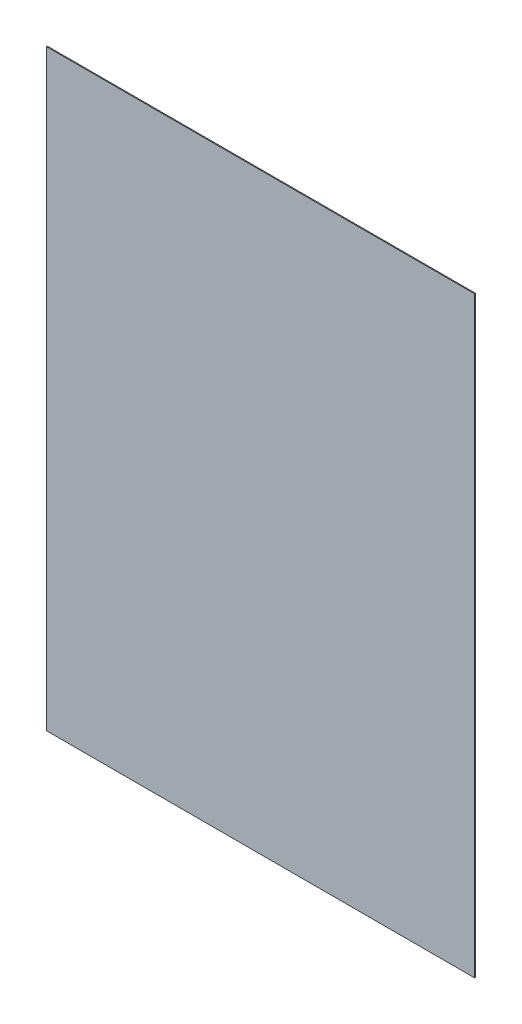
ISO-10303-21;
HEADER;
FILE_DESCRIPTION(('STEP AP214'),'2;1');
FILE_NAME('part.step','',(''),(''),'','','');
FILE_SCHEMA(('AUTOMOTIVE_DESIGN { 1 0 10303 214 1 1 1 1 }'));
ENDSEC;
DATA;
#1=APPLICATION_CONTEXT('core data for automotive mechanical design processes');
#2=APPLICATION_PROTOCOL_DEFINITION('international standard','automotive_design',2000,#1);
#3=PRODUCT_CONTEXT('',#1,'mechanical');
#4=PRODUCT('Part','Part','',(#3));
#5=PRODUCT_RELATED_PRODUCT_CATEGORY('part','',(#4));
#6=PRODUCT_DEFINITION_FORMATION('','',#4);
#7=PRODUCT_DEFINITION_CONTEXT('part definition',#1,'design');
#8=PRODUCT_DEFINITION('design','',#6,#7);
#9=PRODUCT_DEFINITION_SHAPE('','',#8);
#10=(LENGTH_UNIT() NAMED_UNIT(*) SI_UNIT(.MILLI.,.METRE.));
#11=(NAMED_UNIT(*) PLANE_ANGLE_UNIT() SI_UNIT($,.RADIAN.));
#12=(NAMED_UNIT(*) SI_UNIT($,.STERADIAN.) SOLID_ANGLE_UNIT());
#13=UNCERTAINTY_MEASURE_WITH_UNIT(LENGTH_MEASURE(1.E-05),#10,'distance_accuracy_value','');
#14=(GEOMETRIC_REPRESENTATION_CONTEXT(3) GLOBAL_UNCERTAINTY_ASSIGNED_CONTEXT((#13)) GLOBAL_UNIT_ASSIGNED_CONTEXT((#10,
#11,#12)) REPRESENTATION_CONTEXT('',''));
#15=CARTESIAN_POINT('',(0.,0.,0.));
#16=DIRECTION('',(0.,0.,1.));
#17=DIRECTION('',(1.,0.,0.));
#18=AXIS2_PLACEMENT_3D('',#15,#16,#17);
#19=CARTESIAN_POINT('',(29.9050632911392,167.985232067511,1.));
#20=DIRECTION('',(-1.,0.,0.));
#21=DIRECTION('',(0.,-1.,0.));
#22=AXIS2_PLACEMENT_3D('',#19,#20,#21);
#23=PLANE('',#22);
#24=DIRECTION('',(0.,1.,0.));
#25=VECTOR('',#24,1.);
#26=CARTESIAN_POINT('',(29.9050632911392,167.985232067511,0.));
#27=LINE('',#26,#25);
#28=CARTESIAN_POINT('',(29.9050632911393,-482.01476793249,0.));
#29=VERTEX_POINT('',#28);
#30=CARTESIAN_POINT('',(29.9050632911392,167.985232067511,0.));
#31=VERTEX_POINT('',#30);
#32=EDGE_CURVE('E98',#29,#31,#27,.T.);
#33=ORIENTED_EDGE('',*,*,#32,.T.);
#34=DIRECTION('',(0.,0.,-1.));
#35=VECTOR('',#34,1.);
#36=CARTESIAN_POINT('',(29.9050632911392,167.985232067511,1.));
#37=LINE('',#36,#35);
#38=CARTESIAN_POINT('',(29.9050632911392,167.985232067511,1.));
#39=VERTEX_POINT('',#38);
#40=EDGE_CURVE('E11',#39,#31,#37,.T.);
#41=ORIENTED_EDGE('',*,*,#40,.F.);
#42=DIRECTION('',(0.,1.,0.));
#43=VECTOR('',#42,1.);
#44=CARTESIAN_POINT('',(29.9050632911392,167.985232067511,1.));
#45=LINE('',#44,#43);
#46=CARTESIAN_POINT('',(29.9050632911393,-482.01476793249,1.));
#47=VERTEX_POINT('',#46);
#48=EDGE_CURVE('E86',#47,#39,#45,.T.);
#49=ORIENTED_EDGE('',*,*,#48,.F.);
#50=DIRECTION('',(0.,0.,-1.));
#51=VECTOR('',#50,1.);
#52=CARTESIAN_POINT('',(29.9050632911393,-482.01476793249,1.));
#53=LINE('',#52,#51);
#54=EDGE_CURVE('E94',#47,#29,#53,.T.);
#55=ORIENTED_EDGE('',*,*,#54,.T.);
#56=EDGE_LOOP('',(#33,#41,#49,#55));
#57=FACE_BOUND('',#56,.T.);
#58=ADVANCED_FACE('F35',(#57),#23,.F.);
#59=CARTESIAN_POINT('',(-440.094936708861,167.985232067511,1.));
#60=DIRECTION('',(0.,-1.,0.));
#61=DIRECTION('',(0.,0.,-1.));
#62=AXIS2_PLACEMENT_3D('',#59,#60,#61);
#63=PLANE('',#62);
#64=DIRECTION('',(-1.,0.,0.));
#65=VECTOR('',#64,1.);
#66=CARTESIAN_POINT('',(-440.094936708861,167.985232067511,0.));
#67=LINE('',#66,#65);
#68=CARTESIAN_POINT('',(-440.094936708861,167.985232067511,0.));
#69=VERTEX_POINT('',#68);
#70=EDGE_CURVE('E90',#31,#69,#67,.T.);
#71=ORIENTED_EDGE('',*,*,#70,.T.);
#72=DIRECTION('',(0.,0.,-1.));
#73=VECTOR('',#72,1.);
#74=CARTESIAN_POINT('',(-440.094936708861,167.985232067511,1.));
#75=LINE('',#74,#73);
#76=CARTESIAN_POINT('',(-440.094936708861,167.985232067511,1.));
#77=VERTEX_POINT('',#76);
#78=EDGE_CURVE('E43',#77,#69,#75,.T.);
#79=ORIENTED_EDGE('',*,*,#78,.F.);
#80=DIRECTION('',(-1.,0.,0.));
#81=VECTOR('',#80,1.);
#82=CARTESIAN_POINT('',(-440.094936708861,167.985232067511,1.));
#83=LINE('',#82,#81);
#84=EDGE_CURVE('E81',#39,#77,#83,.T.);
#85=ORIENTED_EDGE('',*,*,#84,.F.);
#86=ORIENTED_EDGE('',*,*,#40,.T.);
#87=EDGE_LOOP('',(#71,#79,#85,#86));
#88=FACE_BOUND('',#87,.T.);
#89=ADVANCED_FACE('F89',(#88),#63,.F.);
#90=CARTESIAN_POINT('',(-440.094936708861,167.985232067511,1.));
#91=DIRECTION('',(1.,0.,0.));
#92=DIRECTION('',(0.,1.,0.));
#93=AXIS2_PLACEMENT_3D('',#90,#91,#92);
#94=PLANE('',#93);
#95=DIRECTION('',(0.,-1.,0.));
#96=VECTOR('',#95,1.);
#97=CARTESIAN_POINT('',(-440.094936708861,167.985232067511,0.));
#98=LINE('',#97,#96);
#99=CARTESIAN_POINT('',(-440.094936708861,-482.01476793249,0.));
#100=VERTEX_POINT('',#99);
#101=EDGE_CURVE('E68',#69,#100,#98,.T.);
#102=ORIENTED_EDGE('',*,*,#101,.T.);
#103=DIRECTION('',(0.,0.,-1.));
#104=VECTOR('',#103,1.);
#105=CARTESIAN_POINT('',(-440.094936708861,-482.01476793249,1.));
#106=LINE('',#105,#104);
#107=CARTESIAN_POINT('',(-440.094936708861,-482.01476793249,1.));
#108=VERTEX_POINT('',#107);
#109=EDGE_CURVE('E91',#108,#100,#106,.T.);
#110=ORIENTED_EDGE('',*,*,#109,.F.);
#111=DIRECTION('',(0.,-1.,0.));
#112=VECTOR('',#111,1.);
#113=CARTESIAN_POINT('',(-440.094936708861,167.985232067511,1.));
#114=LINE('',#113,#112);
#115=EDGE_CURVE('E84',#77,#108,#114,.T.);
#116=ORIENTED_EDGE('',*,*,#115,.F.);
#117=ORIENTED_EDGE('',*,*,#78,.T.);
#118=EDGE_LOOP('',(#102,#110,#116,#117));
#119=FACE_BOUND('',#118,.T.);
#120=ADVANCED_FACE('F92',(#119),#94,.F.);
#121=CARTESIAN_POINT('',(-440.094936708861,-482.01476793249,1.));
#122=DIRECTION('',(0.,1.,0.));
#123=DIRECTION('',(0.,0.,1.));
#124=AXIS2_PLACEMENT_3D('',#121,#122,#123);
#125=PLANE('',#124);
#126=DIRECTION('',(1.,0.,0.));
#127=VECTOR('',#126,1.);
#128=CARTESIAN_POINT('',(-440.094936708861,-482.01476793249,0.));
#129=LINE('',#128,#127);
#130=EDGE_CURVE('E74',#100,#29,#129,.T.);
#131=ORIENTED_EDGE('',*,*,#130,.T.);
#132=ORIENTED_EDGE('',*,*,#54,.F.);
#133=DIRECTION('',(1.,0.,0.));
#134=VECTOR('',#133,1.);
#135=CARTESIAN_POINT('',(-440.094936708861,-482.01476793249,1.));
#136=LINE('',#135,#134);
#137=EDGE_CURVE('E51',#108,#47,#136,.T.);
#138=ORIENTED_EDGE('',*,*,#137,.F.);
#139=ORIENTED_EDGE('',*,*,#109,.T.);
#140=EDGE_LOOP('',(#131,#132,#138,#139));
#141=FACE_BOUND('',#140,.T.);
#142=ADVANCED_FACE('F105',(#141),#125,.F.);
#143=CARTESIAN_POINT('',(0.,0.,1.));
#144=DIRECTION('',(0.,0.,1.));
#145=DIRECTION('',(1.,0.,0.));
#146=AXIS2_PLACEMENT_3D('',#143,#144,#145);
#147=PLANE('',#146);
#148=ORIENTED_EDGE('',*,*,#48,.T.);
#149=ORIENTED_EDGE('',*,*,#84,.T.);
#150=ORIENTED_EDGE('',*,*,#115,.T.);
#151=ORIENTED_EDGE('',*,*,#137,.T.);
#152=EDGE_LOOP('',(#148,#149,#150,#151));
#153=FACE_BOUND('',#152,.T.);
#154=ADVANCED_FACE('F82',(#153),#147,.T.);
#155=CARTESIAN_POINT('',(0.,0.,0.));
#156=DIRECTION('',(0.,0.,1.));
#157=DIRECTION('',(1.,0.,0.));
#158=AXIS2_PLACEMENT_3D('',#155,#156,#157);
#159=PLANE('',#158);
#160=ORIENTED_EDGE('',*,*,#32,.F.);
#161=ORIENTED_EDGE('',*,*,#130,.F.);
#162=ORIENTED_EDGE('',*,*,#101,.F.);
#163=ORIENTED_EDGE('',*,*,#70,.F.);
#164=EDGE_LOOP('',(#160,#161,#162,#163));
#165=FACE_BOUND('',#164,.T.);
#166=ADVANCED_FACE('F108',(#165),#159,.F.);
#167=CLOSED_SHELL('',(#58,#89,#120,#142,#154,#166));
#168=MANIFOLD_SOLID_BREP('B2',#167);
#169=ADVANCED_BREP_SHAPE_REPRESENTATION('',(#18,#168),#14);
#170=SHAPE_DEFINITION_REPRESENTATION(#9,#169);
ENDSEC;
END-ISO-10303-21;
